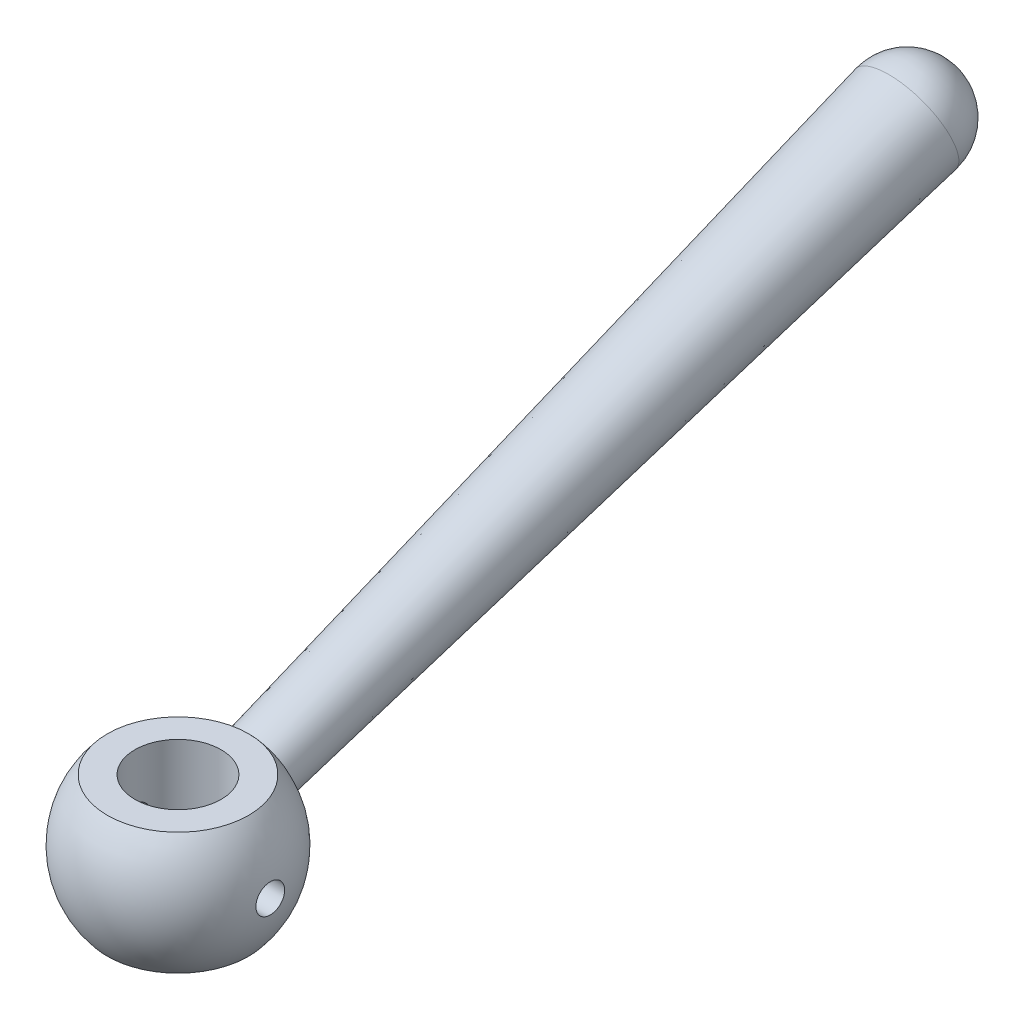
ISO-10303-21;
HEADER;
FILE_DESCRIPTION(('STEP AP214'),'2;1');
FILE_NAME('part.step','',(''),(''),'','','');
FILE_SCHEMA(('AUTOMOTIVE_DESIGN { 1 0 10303 214 1 1 1 1 }'));
ENDSEC;
DATA;
#1=APPLICATION_CONTEXT('core data for automotive mechanical design processes');
#2=APPLICATION_PROTOCOL_DEFINITION('international standard','automotive_design',2000,#1);
#3=PRODUCT_CONTEXT('',#1,'mechanical');
#4=PRODUCT('Part','Part','',(#3));
#5=PRODUCT_RELATED_PRODUCT_CATEGORY('part','',(#4));
#6=PRODUCT_DEFINITION_FORMATION('','',#4);
#7=PRODUCT_DEFINITION_CONTEXT('part definition',#1,'design');
#8=PRODUCT_DEFINITION('design','',#6,#7);
#9=PRODUCT_DEFINITION_SHAPE('','',#8);
#10=(LENGTH_UNIT() NAMED_UNIT(*) SI_UNIT(.MILLI.,.METRE.));
#11=(NAMED_UNIT(*) PLANE_ANGLE_UNIT() SI_UNIT($,.RADIAN.));
#12=(NAMED_UNIT(*) SI_UNIT($,.STERADIAN.) SOLID_ANGLE_UNIT());
#13=UNCERTAINTY_MEASURE_WITH_UNIT(LENGTH_MEASURE(1.E-05),#10,'distance_accuracy_value','');
#14=(GEOMETRIC_REPRESENTATION_CONTEXT(3) GLOBAL_UNCERTAINTY_ASSIGNED_CONTEXT((#13)) GLOBAL_UNIT_ASSIGNED_CONTEXT((#10,
#11,#12)) REPRESENTATION_CONTEXT('',''));
#15=CARTESIAN_POINT('',(0.,0.,0.));
#16=DIRECTION('',(0.,0.,1.));
#17=DIRECTION('',(1.,0.,0.));
#18=AXIS2_PLACEMENT_3D('',#15,#16,#17);
#19=CARTESIAN_POINT('',(0.,0.,0.));
#20=DIRECTION('',(0.,1.,0.));
#21=DIRECTION('',(0.,0.,-1.));
#22=AXIS2_PLACEMENT_3D('',#19,#20,#21);
#23=SPHERICAL_SURFACE('',#22,13.);
#24=CARTESIAN_POINT('',(0.,4.17217184381413,-11.4629479309636));
#25=DIRECTION('',(0.,0.34202014332567,-0.939692620785908));
#26=DIRECTION('',(0.,0.939692620785908,0.34202014332567));
#27=AXIS2_PLACEMENT_3D('',#24,#25,#26);
#28=CIRCLE('',#27,4.4937519777688);
#29=CARTESIAN_POINT('',(0.,8.39491741696555,-9.92599423545715));
#30=VERTEX_POINT('',#29);
#31=EDGE_CURVE('E119',#30,#30,#28,.T.);
#32=ORIENTED_EDGE('',*,*,#31,.F.);
#33=EDGE_LOOP('',(#32));
#34=FACE_BOUND('',#33,.T.);
#35=CARTESIAN_POINT('',(12.8452325786651,0.,0.));
#36=DIRECTION('',(-1.,0.,0.));
#37=DIRECTION('',(0.,0.,1.));
#38=AXIS2_PLACEMENT_3D('',#35,#36,#37);
#39=CIRCLE('',#38,2.);
#40=CARTESIAN_POINT('',(12.8452325786651,0.,2.));
#41=VERTEX_POINT('',#40);
#42=EDGE_CURVE('E108',#41,#41,#39,.T.);
#43=ORIENTED_EDGE('',*,*,#42,.T.);
#44=EDGE_LOOP('',(#43));
#45=FACE_BOUND('',#44,.T.);
#46=CARTESIAN_POINT('',(-12.8452325786651,0.,0.));
#47=DIRECTION('',(1.,0.,0.));
#48=DIRECTION('',(0.,0.,-1.));
#49=AXIS2_PLACEMENT_3D('',#46,#47,#48);
#50=CIRCLE('',#49,2.);
#51=CARTESIAN_POINT('',(-12.8452325786651,0.,-2.));
#52=VERTEX_POINT('',#51);
#53=EDGE_CURVE('E112',#52,#52,#50,.T.);
#54=ORIENTED_EDGE('',*,*,#53,.T.);
#55=EDGE_LOOP('',(#54));
#56=FACE_BOUND('',#55,.T.);
#57=CARTESIAN_POINT('',(0.,0.,13.));
#58=VERTEX_POINT('',#57);
#59=VERTEX_LOOP('',#58);
#60=FACE_BOUND('',#59,.T.);
#61=CARTESIAN_POINT('',(0.,8.5,0.));
#62=DIRECTION('',(0.,1.,0.));
#63=DIRECTION('',(0.,0.,1.));
#64=AXIS2_PLACEMENT_3D('',#61,#62,#63);
#65=CIRCLE('',#64,9.836157786453);
#66=CARTESIAN_POINT('',(0.,8.5,9.836157786453));
#67=VERTEX_POINT('',#66);
#68=EDGE_CURVE('E61',#67,#67,#65,.T.);
#69=ORIENTED_EDGE('',*,*,#68,.F.);
#70=EDGE_LOOP('',(#69));
#71=FACE_BOUND('',#70,.T.);
#72=CARTESIAN_POINT('',(0.,-8.5,0.));
#73=DIRECTION('',(0.,-1.,0.));
#74=DIRECTION('',(0.,0.,-1.));
#75=AXIS2_PLACEMENT_3D('',#72,#73,#74);
#76=CIRCLE('',#75,9.836157786453);
#77=CARTESIAN_POINT('',(0.,-8.5,-9.836157786453));
#78=VERTEX_POINT('',#77);
#79=EDGE_CURVE('E12',#78,#78,#76,.T.);
#80=ORIENTED_EDGE('',*,*,#79,.F.);
#81=EDGE_LOOP('',(#80));
#82=FACE_BOUND('',#81,.T.);
#83=ADVANCED_FACE('F48',(#34,#45,#56,#60,#71,#82),#23,.T.);
#84=CARTESIAN_POINT('',(-13.,8.5,13.));
#85=DIRECTION('',(0.,1.,0.));
#86=DIRECTION('',(0.,0.,1.));
#87=AXIS2_PLACEMENT_3D('',#84,#85,#86);
#88=PLANE('',#87);
#89=CARTESIAN_POINT('',(0.,8.5,0.));
#90=DIRECTION('',(0.,1.,0.));
#91=DIRECTION('',(0.,0.,1.));
#92=AXIS2_PLACEMENT_3D('',#89,#90,#91);
#93=CIRCLE('',#92,6.);
#94=CARTESIAN_POINT('',(0.,8.5,6.));
#95=VERTEX_POINT('',#94);
#96=EDGE_CURVE('E101',#95,#95,#93,.T.);
#97=ORIENTED_EDGE('',*,*,#96,.F.);
#98=EDGE_LOOP('',(#97));
#99=FACE_BOUND('',#98,.T.);
#100=ORIENTED_EDGE('',*,*,#68,.T.);
#101=EDGE_LOOP('',(#100));
#102=FACE_BOUND('',#101,.T.);
#103=ADVANCED_FACE('F67',(#99,#102),#88,.T.);
#104=CARTESIAN_POINT('',(-13.,-8.5,13.));
#105=DIRECTION('',(0.,-1.,0.));
#106=DIRECTION('',(0.,0.,-1.));
#107=AXIS2_PLACEMENT_3D('',#104,#105,#106);
#108=PLANE('',#107);
#109=CARTESIAN_POINT('',(0.,-8.5,0.));
#110=DIRECTION('',(0.,1.,0.));
#111=DIRECTION('',(0.,0.,1.));
#112=AXIS2_PLACEMENT_3D('',#109,#110,#111);
#113=CIRCLE('',#112,6.);
#114=CARTESIAN_POINT('',(0.,-8.5,6.));
#115=VERTEX_POINT('',#114);
#116=EDGE_CURVE('E105',#115,#115,#113,.T.);
#117=ORIENTED_EDGE('',*,*,#116,.T.);
#118=EDGE_LOOP('',(#117));
#119=FACE_BOUND('',#118,.T.);
#120=ORIENTED_EDGE('',*,*,#79,.T.);
#121=EDGE_LOOP('',(#120));
#122=FACE_BOUND('',#121,.T.);
#123=ADVANCED_FACE('F74',(#119,#122),#108,.T.);
#124=CARTESIAN_POINT('',(0.,-8.5,0.));
#125=DIRECTION('',(0.,1.,0.));
#126=DIRECTION('',(0.,0.,1.));
#127=AXIS2_PLACEMENT_3D('',#124,#125,#126);
#128=CYLINDRICAL_SURFACE('',#127,6.);
#129=CARTESIAN_POINT('',(-5.65685424949238,0.,-2.));
#130=CARTESIAN_POINT('',(-5.65685389060868,-0.108936349672144,-2.00000051589543));
#131=CARTESIAN_POINT('',(-5.66003538581715,-0.217869599647185,-1.99106956737104));
#132=CARTESIAN_POINT('',(-5.6723514816251,-0.432508841988498,-1.95570226337762));
#133=CARTESIAN_POINT('',(-5.68148706284378,-0.538214299744939,-1.92926302433679));
#134=CARTESIAN_POINT('',(-5.70456407377583,-0.743253785994576,-1.85991097136981));
#135=CARTESIAN_POINT('',(-5.71849607942644,-0.842599858885432,-1.81703044280649));
#136=CARTESIAN_POINT('',(-5.74958244020649,-1.03272009709592,-1.71612325688276));
#137=CARTESIAN_POINT('',(-5.76673750607225,-1.12349236510726,-1.65809325772037));
#138=CARTESIAN_POINT('',(-5.80308978814946,-1.29743992467663,-1.52610229288576));
#139=CARTESIAN_POINT('',(-5.82233789689288,-1.38023085734346,-1.45164868275584));
#140=CARTESIAN_POINT('',(-5.86027729602006,-1.53241360244928,-1.28997533442879));
#141=CARTESIAN_POINT('',(-5.87896849657923,-1.60180326316474,-1.20275355010475));
#142=CARTESIAN_POINT('',(-5.91427733843598,-1.72695779465919,-1.01520901593002));
#143=CARTESIAN_POINT('',(-5.93082815403211,-1.78231994123592,-0.91460382244905));
#144=CARTESIAN_POINT('',(-5.95939173541966,-1.87518317025502,-0.704862445974947));
#145=CARTESIAN_POINT('',(-5.97140572406004,-1.91268906635381,-0.595728571374423));
#146=CARTESIAN_POINT('',(-5.98918150863813,-1.96747170926479,-0.376057634866988));
#147=CARTESIAN_POINT('',(-5.99514629555118,-1.98540689251401,-0.265701509705936));
#148=CARTESIAN_POINT('',(-6.00087216436496,-2.00263258672132,-0.0433957496481787));
#149=CARTESIAN_POINT('',(-6.00063484525791,-2.00192790330482,0.068553467087793));
#150=CARTESIAN_POINT('',(-5.99412079237463,-1.98231149086794,0.286207030387629));
#151=CARTESIAN_POINT('',(-5.98808129510235,-1.96411494305102,0.391984097183313));
#152=CARTESIAN_POINT('',(-5.97093934679463,-1.91121403803905,0.598886877644343));
#153=CARTESIAN_POINT('',(-5.95983655262364,-1.87650856204035,0.700012275558432));
#154=CARTESIAN_POINT('',(-5.93351340586448,-1.79115736538788,0.896304949683946));
#155=CARTESIAN_POINT('',(-5.91824085048031,-1.74030812290698,0.99137644193769));
#156=CARTESIAN_POINT('',(-5.88516786077838,-1.62428058910269,1.17184865105465));
#157=CARTESIAN_POINT('',(-5.86736672402934,-1.55909831334474,1.25724666877068));
#158=CARTESIAN_POINT('',(-5.83012383699793,-1.4126512130806,1.42020173310262));
#159=CARTESIAN_POINT('',(-5.81064430337755,-1.33077368431704,1.49720031413054));
#160=CARTESIAN_POINT('',(-5.77294670497801,-1.15510254854676,1.63655451919635));
#161=CARTESIAN_POINT('',(-5.75472883491231,-1.06130710854391,1.69890788656309));
#162=CARTESIAN_POINT('',(-5.72141050242225,-0.86269274879312,1.80797491007149));
#163=CARTESIAN_POINT('',(-5.70635818569496,-0.757735737364451,1.85445292724268));
#164=CARTESIAN_POINT('',(-5.6816330164877,-0.540857211571164,1.92888638653867));
#165=CARTESIAN_POINT('',(-5.67195790974185,-0.428938637587508,1.95684959149499));
#166=CARTESIAN_POINT('',(-5.6595927263117,-0.20672328917685,1.99232256419504));
#167=CARTESIAN_POINT('',(-5.65660720637512,-0.0965811505026873,2.00069819101527));
#168=CARTESIAN_POINT('',(-5.65713344118369,0.123552298228214,1.99921087781944));
#169=CARTESIAN_POINT('',(-5.66064401583629,0.233543632047977,1.98935125045353));
#170=CARTESIAN_POINT('',(-5.67347236180599,0.446313931423819,1.95245130310462));
#171=CARTESIAN_POINT('',(-5.68258650881681,0.549210860301683,1.92601278796137));
#172=CARTESIAN_POINT('',(-5.70537107342046,0.749087212478369,1.85742772512093));
#173=CARTESIAN_POINT('',(-5.71904229869679,0.846065583181561,1.81527839272684));
#174=CARTESIAN_POINT('',(-5.74993755191574,1.034760841694,1.71494868147787));
#175=CARTESIAN_POINT('',(-5.76726051331257,1.1262132852836,1.65630223671699));
#176=CARTESIAN_POINT('',(-5.8033153746193,1.29829210476744,1.52517126111512));
#177=CARTESIAN_POINT('',(-5.82204768887589,1.37891527732244,1.45268265099756));
#178=CARTESIAN_POINT('',(-5.85990077275698,1.53105596818128,1.29178341180065));
#179=CARTESIAN_POINT('',(-5.87899687155793,1.6019487800377,1.2027745410933));
#180=CARTESIAN_POINT('',(-5.91453703226218,1.72783228469609,1.01365458280051));
#181=CARTESIAN_POINT('',(-5.9309811883539,1.78282354232485,0.913543889729104));
#182=CARTESIAN_POINT('',(-5.95928811621206,1.87484020972343,0.705559724864591));
#183=CARTESIAN_POINT('',(-5.97118060009062,1.91198255429613,0.597742246642393));
#184=CARTESIAN_POINT('',(-5.98917221675549,1.96745548412021,0.376916931692033));
#185=CARTESIAN_POINT('',(-5.99527344068038,1.985792859761,0.263910983907779));
#186=CARTESIAN_POINT('',(-6.00083726472513,2.00252415521128,0.0416306717200813));
#187=CARTESIAN_POINT('',(-6.00059840178878,2.00181490786475,-0.0675694478400376));
#188=CARTESIAN_POINT('',(-5.99424393038796,1.98268538370718,-0.284222290000348));
#189=CARTESIAN_POINT('',(-5.98812879867152,1.96426654369446,-0.391675153638114));
#190=CARTESIAN_POINT('',(-5.97081829908825,1.91083553084807,-0.600084238864118));
#191=CARTESIAN_POINT('',(-5.95970516722297,1.87609156929413,-0.701116541825579));
#192=CARTESIAN_POINT('',(-5.9335432140899,1.79124493780569,-0.895956701879591));
#193=CARTESIAN_POINT('',(-5.91849368096033,1.74113948960597,-0.989763248284865));
#194=CARTESIAN_POINT('',(-5.88531737655762,1.62486097579598,-1.17126803261757));
#195=CARTESIAN_POINT('',(-5.86709744983853,1.55816262923672,-1.25861250311521));
#196=CARTESIAN_POINT('',(-5.82985977583759,1.41148521768761,-1.42116205254485));
#197=CARTESIAN_POINT('',(-5.81084177546194,1.33150191547454,-1.49636324324918));
#198=CARTESIAN_POINT('',(-5.77326559651196,1.1567812888261,-1.63548361766624));
#199=CARTESIAN_POINT('',(-5.75475455977261,1.06158897804672,-1.6988459319958));
#200=CARTESIAN_POINT('',(-5.72120386646031,0.861331146194439,-1.80862868660223));
#201=CARTESIAN_POINT('',(-5.70616330322499,0.756268213940669,-1.85505355363895));
#202=CARTESIAN_POINT('',(-5.68202668413029,0.544076351968735,-1.92768765640833));
#203=CARTESIAN_POINT('',(-5.67269265714364,0.437255472949267,-1.95471581829904));
#204=CARTESIAN_POINT('',(-5.66010767079037,0.220287899066596,-1.99086864029853));
#205=CARTESIAN_POINT('',(-5.65685461234922,0.110142365178581,-1.99999947839318));
#206=CARTESIAN_POINT('',(-5.65685424949238,0.,-2.));
#207=B_SPLINE_CURVE_WITH_KNOTS('',3,(#129,#130,#131,#132,#133,#134,#135,#136,#137,#138,#139,
#140,#141,#142,#143,#144,#145,#146,#147,#148,#149,#150,#151,#152,#153,#154,#155,#156,#157,#158,
#159,#160,#161,#162,#163,#164,#165,#166,#167,#168,#169,#170,#171,#172,#173,#174,#175,#176,#177,
#178,#179,#180,#181,#182,#183,#184,#185,#186,#187,#188,#189,#190,#191,#192,#193,#194,#195,#196,
#197,#198,#199,#200,#201,#202,#203,#204,#205,#206),.UNSPECIFIED.,.T.,.F.,(4,2,2,2,2,2,2,2,2,2,2,
2,2,2,2,2,2,2,2,2,2,2,2,2,2,2,2,2,2,2,2,2,2,2,2,2,2,2,4),(0.,0.326401169598712,
0.652856110030327,0.978673255001655,1.30456233237088,1.64202674855136,1.97954530343976,
2.32587012287314,2.67210152773578,3.00628637529868,3.34038506604654,3.66138009651138,
3.98239688378473,4.3076330972067,4.63295983748044,4.97360348727835,5.31429959224212,
5.65985279686111,6.00526102713231,6.33508582728879,6.66485071674467,6.98328791537552,
7.30178158293891,7.63037715471429,7.95906971324254,8.30357616342185,8.64807037515064,
8.99027582381703,9.33235766008313,9.6583616935527,9.98433928019562,10.3051391208086,
10.6259970152648,10.9587103904127,11.2915300886526,11.6373780547229,11.9831355653373,
12.3132642432538,12.6432789438093),.UNSPECIFIED.);
#208=CARTESIAN_POINT('',(-5.65685424949238,0.,-2.));
#209=VERTEX_POINT('',#208);
#210=EDGE_CURVE('E51',#209,#209,#207,.T.);
#211=ORIENTED_EDGE('',*,*,#210,.T.);
#212=EDGE_LOOP('',(#211));
#213=FACE_BOUND('',#212,.T.);
#214=CARTESIAN_POINT('',(5.65685424949238,0.,-2.));
#215=CARTESIAN_POINT('',(5.65685389060868,0.108936349672144,-2.00000051589543));
#216=CARTESIAN_POINT('',(5.66003538581715,0.217869599647185,-1.99106956737104));
#217=CARTESIAN_POINT('',(5.6723514816251,0.432508841988498,-1.95570226337762));
#218=CARTESIAN_POINT('',(5.68148706284378,0.538214299744939,-1.92926302433679));
#219=CARTESIAN_POINT('',(5.70456407377583,0.743253785994576,-1.85991097136981));
#220=CARTESIAN_POINT('',(5.71849607942644,0.842599858885432,-1.81703044280649));
#221=CARTESIAN_POINT('',(5.74958244020649,1.03272009709592,-1.71612325688276));
#222=CARTESIAN_POINT('',(5.76673750607225,1.12349236510726,-1.65809325772037));
#223=CARTESIAN_POINT('',(5.80308978814946,1.29743992467663,-1.52610229288576));
#224=CARTESIAN_POINT('',(5.82233789689288,1.38023085734346,-1.45164868275584));
#225=CARTESIAN_POINT('',(5.86027729602006,1.53241360244928,-1.28997533442879));
#226=CARTESIAN_POINT('',(5.87896849657923,1.60180326316474,-1.20275355010475));
#227=CARTESIAN_POINT('',(5.91427733843598,1.72695779465919,-1.01520901593002));
#228=CARTESIAN_POINT('',(5.93082815403211,1.78231994123592,-0.91460382244905));
#229=CARTESIAN_POINT('',(5.95939173541966,1.87518317025502,-0.704862445974947));
#230=CARTESIAN_POINT('',(5.97140572406004,1.91268906635381,-0.595728571374423));
#231=CARTESIAN_POINT('',(5.98918150863813,1.96747170926479,-0.376057634866988));
#232=CARTESIAN_POINT('',(5.99514629555118,1.98540689251401,-0.265701509705936));
#233=CARTESIAN_POINT('',(6.00087216436496,2.00263258672132,-0.0433957496481787));
#234=CARTESIAN_POINT('',(6.00063484525791,2.00192790330482,0.068553467087793));
#235=CARTESIAN_POINT('',(5.99412079237463,1.98231149086794,0.286207030387629));
#236=CARTESIAN_POINT('',(5.98808129510235,1.96411494305102,0.391984097183313));
#237=CARTESIAN_POINT('',(5.97093934679463,1.91121403803905,0.598886877644343));
#238=CARTESIAN_POINT('',(5.95983655262364,1.87650856204035,0.700012275558432));
#239=CARTESIAN_POINT('',(5.93351340586448,1.79115736538788,0.896304949683946));
#240=CARTESIAN_POINT('',(5.91824085048031,1.74030812290698,0.99137644193769));
#241=CARTESIAN_POINT('',(5.88516786077838,1.62428058910269,1.17184865105465));
#242=CARTESIAN_POINT('',(5.86736672402934,1.55909831334474,1.25724666877068));
#243=CARTESIAN_POINT('',(5.83012383699793,1.4126512130806,1.42020173310262));
#244=CARTESIAN_POINT('',(5.81064430337755,1.33077368431704,1.49720031413054));
#245=CARTESIAN_POINT('',(5.77294670497801,1.15510254854676,1.63655451919635));
#246=CARTESIAN_POINT('',(5.75472883491231,1.06130710854391,1.69890788656309));
#247=CARTESIAN_POINT('',(5.72141050242225,0.86269274879312,1.80797491007149));
#248=CARTESIAN_POINT('',(5.70635818569496,0.757735737364451,1.85445292724268));
#249=CARTESIAN_POINT('',(5.6816330164877,0.540857211571164,1.92888638653867));
#250=CARTESIAN_POINT('',(5.67195790974185,0.428938637587508,1.95684959149499));
#251=CARTESIAN_POINT('',(5.6595927263117,0.20672328917685,1.99232256419504));
#252=CARTESIAN_POINT('',(5.65660720637512,0.0965811505026873,2.00069819101527));
#253=CARTESIAN_POINT('',(5.65713344118369,-0.123552298228214,1.99921087781944));
#254=CARTESIAN_POINT('',(5.66064401583629,-0.233543632047977,1.98935125045353));
#255=CARTESIAN_POINT('',(5.67347236180599,-0.446313931423819,1.95245130310462));
#256=CARTESIAN_POINT('',(5.68258650881681,-0.549210860301683,1.92601278796137));
#257=CARTESIAN_POINT('',(5.70537107342046,-0.749087212478369,1.85742772512093));
#258=CARTESIAN_POINT('',(5.71904229869679,-0.846065583181561,1.81527839272684));
#259=CARTESIAN_POINT('',(5.74993755191574,-1.034760841694,1.71494868147787));
#260=CARTESIAN_POINT('',(5.76726051331257,-1.1262132852836,1.65630223671699));
#261=CARTESIAN_POINT('',(5.8033153746193,-1.29829210476744,1.52517126111512));
#262=CARTESIAN_POINT('',(5.82204768887589,-1.37891527732244,1.45268265099756));
#263=CARTESIAN_POINT('',(5.85990077275698,-1.53105596818128,1.29178341180065));
#264=CARTESIAN_POINT('',(5.87899687155793,-1.6019487800377,1.2027745410933));
#265=CARTESIAN_POINT('',(5.91453703226218,-1.72783228469609,1.01365458280051));
#266=CARTESIAN_POINT('',(5.9309811883539,-1.78282354232485,0.913543889729104));
#267=CARTESIAN_POINT('',(5.95928811621206,-1.87484020972343,0.705559724864591));
#268=CARTESIAN_POINT('',(5.97118060009062,-1.91198255429613,0.597742246642393));
#269=CARTESIAN_POINT('',(5.98917221675549,-1.96745548412021,0.376916931692033));
#270=CARTESIAN_POINT('',(5.99527344068038,-1.985792859761,0.263910983907779));
#271=CARTESIAN_POINT('',(6.00083726472513,-2.00252415521128,0.0416306717200813));
#272=CARTESIAN_POINT('',(6.00059840178878,-2.00181490786475,-0.0675694478400376));
#273=CARTESIAN_POINT('',(5.99424393038796,-1.98268538370718,-0.284222290000348));
#274=CARTESIAN_POINT('',(5.98812879867152,-1.96426654369446,-0.391675153638114));
#275=CARTESIAN_POINT('',(5.97081829908825,-1.91083553084807,-0.600084238864118));
#276=CARTESIAN_POINT('',(5.95970516722297,-1.87609156929413,-0.701116541825579));
#277=CARTESIAN_POINT('',(5.9335432140899,-1.79124493780569,-0.895956701879591));
#278=CARTESIAN_POINT('',(5.91849368096033,-1.74113948960597,-0.989763248284865));
#279=CARTESIAN_POINT('',(5.88531737655762,-1.62486097579598,-1.17126803261757));
#280=CARTESIAN_POINT('',(5.86709744983853,-1.55816262923672,-1.25861250311521));
#281=CARTESIAN_POINT('',(5.82985977583759,-1.41148521768761,-1.42116205254485));
#282=CARTESIAN_POINT('',(5.81084177546194,-1.33150191547454,-1.49636324324918));
#283=CARTESIAN_POINT('',(5.77326559651196,-1.1567812888261,-1.63548361766624));
#284=CARTESIAN_POINT('',(5.75475455977261,-1.06158897804672,-1.6988459319958));
#285=CARTESIAN_POINT('',(5.72120386646031,-0.861331146194439,-1.80862868660223));
#286=CARTESIAN_POINT('',(5.70616330322499,-0.756268213940669,-1.85505355363895));
#287=CARTESIAN_POINT('',(5.68202668413029,-0.544076351968735,-1.92768765640833));
#288=CARTESIAN_POINT('',(5.67269265714364,-0.437255472949267,-1.95471581829904));
#289=CARTESIAN_POINT('',(5.66010767079037,-0.220287899066596,-1.99086864029853));
#290=CARTESIAN_POINT('',(5.65685461234922,-0.110142365178581,-1.99999947839318));
#291=CARTESIAN_POINT('',(5.65685424949238,0.,-2.));
#292=B_SPLINE_CURVE_WITH_KNOTS('',3,(#214,#215,#216,#217,#218,#219,#220,#221,#222,#223,#224,
#225,#226,#227,#228,#229,#230,#231,#232,#233,#234,#235,#236,#237,#238,#239,#240,#241,#242,#243,
#244,#245,#246,#247,#248,#249,#250,#251,#252,#253,#254,#255,#256,#257,#258,#259,#260,#261,#262,
#263,#264,#265,#266,#267,#268,#269,#270,#271,#272,#273,#274,#275,#276,#277,#278,#279,#280,#281,
#282,#283,#284,#285,#286,#287,#288,#289,#290,#291),.UNSPECIFIED.,.T.,.F.,(4,2,2,2,2,2,2,2,2,2,2,
2,2,2,2,2,2,2,2,2,2,2,2,2,2,2,2,2,2,2,2,2,2,2,2,2,2,2,4),(0.,0.326401169598712,
0.652856110030327,0.978673255001655,1.30456233237088,1.64202674855136,1.97954530343976,
2.32587012287314,2.67210152773578,3.00628637529868,3.34038506604654,3.66138009651138,
3.98239688378473,4.3076330972067,4.63295983748044,4.97360348727835,5.31429959224212,
5.65985279686111,6.00526102713231,6.33508582728879,6.66485071674467,6.98328791537552,
7.30178158293891,7.63037715471429,7.95906971324254,8.30357616342185,8.64807037515064,
8.99027582381703,9.33235766008313,9.6583616935527,9.98433928019562,10.3051391208086,
10.6259970152648,10.9587103904127,11.2915300886526,11.6373780547229,11.9831355653373,
12.3132642432538,12.6432789438093),.UNSPECIFIED.);
#293=CARTESIAN_POINT('',(5.65685424949238,0.,-2.));
#294=VERTEX_POINT('',#293);
#295=EDGE_CURVE('E91',#294,#294,#292,.T.);
#296=ORIENTED_EDGE('',*,*,#295,.T.);
#297=EDGE_LOOP('',(#296));
#298=FACE_BOUND('',#297,.T.);
#299=ORIENTED_EDGE('',*,*,#96,.T.);
#300=EDGE_LOOP('',(#299));
#301=FACE_BOUND('',#300,.T.);
#302=ORIENTED_EDGE('',*,*,#116,.F.);
#303=EDGE_LOOP('',(#302));
#304=FACE_BOUND('',#303,.T.);
#305=ADVANCED_FACE('F76',(#213,#298,#301,#304),#128,.F.);
#306=CARTESIAN_POINT('',(-13.,0.,0.));
#307=DIRECTION('',(1.,0.,0.));
#308=DIRECTION('',(0.,0.,-1.));
#309=AXIS2_PLACEMENT_3D('',#306,#307,#308);
#310=CYLINDRICAL_SURFACE('',#309,2.);
#311=ORIENTED_EDGE('',*,*,#295,.F.);
#312=EDGE_LOOP('',(#311));
#313=FACE_BOUND('',#312,.T.);
#314=ORIENTED_EDGE('',*,*,#42,.F.);
#315=EDGE_LOOP('',(#314));
#316=FACE_BOUND('',#315,.T.);
#317=ADVANCED_FACE('F83',(#313,#316),#310,.F.);
#318=ORIENTED_EDGE('',*,*,#210,.F.);
#319=EDGE_LOOP('',(#318));
#320=FACE_BOUND('',#319,.T.);
#321=ORIENTED_EDGE('',*,*,#53,.F.);
#322=EDGE_LOOP('',(#321));
#323=FACE_BOUND('',#322,.T.);
#324=ADVANCED_FACE('F131',(#320,#323),#310,.F.);
#325=CARTESIAN_POINT('',(0.,36.9381754791723,-101.486803044878));
#326=DIRECTION('',(0.,0.34202014332567,-0.939692620785908));
#327=DIRECTION('',(0.,0.939692620785908,0.34202014332567));
#328=AXIS2_PLACEMENT_3D('',#325,#326,#327);
#329=SPHERICAL_SURFACE('',#328,6.99999999999999);
#330=CARTESIAN_POINT('',(0.,36.8755041738877,-101.314615048761));
#331=DIRECTION('',(0.,0.34202014332567,-0.939692620785908));
#332=DIRECTION('',(0.,0.939692620785908,0.34202014332567));
#333=AXIS2_PLACEMENT_3D('',#330,#331,#332);
#334=CIRCLE('',#333,6.99760127482888);
#335=CARTESIAN_POINT('',(0.,43.4510984550465,-98.921294457808));
#336=VERTEX_POINT('',#335);
#337=EDGE_CURVE('E97',#336,#336,#334,.T.);
#338=ORIENTED_EDGE('',*,*,#337,.T.);
#339=EDGE_LOOP('',(#338));
#340=FACE_BOUND('',#339,.T.);
#341=ADVANCED_FACE('F133',(#340),#329,.T.);
#342=CARTESIAN_POINT('',(0.,36.8755041738877,-101.314615048761));
#343=DIRECTION('',(0.,0.34202014332567,-0.939692620785908));
#344=DIRECTION('',(0.,0.939692620785908,0.34202014332567));
#345=AXIS2_PLACEMENT_3D('',#342,#343,#344);
#346=CONICAL_SURFACE('',#345,6.99760127482889,0.0261799387799151);
#347=ORIENTED_EDGE('',*,*,#31,.T.);
#348=EDGE_LOOP('',(#347));
#349=FACE_BOUND('',#348,.T.);
#350=ORIENTED_EDGE('',*,*,#337,.F.);
#351=EDGE_LOOP('',(#350));
#352=FACE_BOUND('',#351,.T.);
#353=ADVANCED_FACE('F124',(#349,#352),#346,.T.);
#354=CLOSED_SHELL('',(#83,#103,#123,#305,#317,#324,#341,#353));
#355=MANIFOLD_SOLID_BREP('B2',#354);
#356=ADVANCED_BREP_SHAPE_REPRESENTATION('',(#18,#355),#14);
#357=SHAPE_DEFINITION_REPRESENTATION(#9,#356);
ENDSEC;
END-ISO-10303-21;
